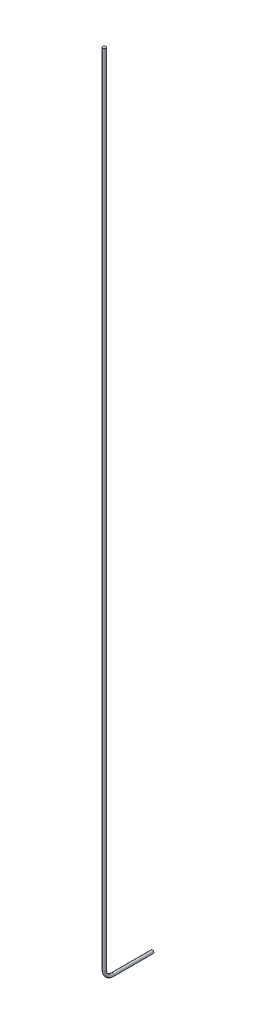
ISO-10303-21;
HEADER;
FILE_DESCRIPTION(('STEP AP214'),'2;1');
FILE_NAME('part.step','',(''),(''),'','','');
FILE_SCHEMA(('AUTOMOTIVE_DESIGN { 1 0 10303 214 1 1 1 1 }'));
ENDSEC;
DATA;
#1=APPLICATION_CONTEXT('core data for automotive mechanical design processes');
#2=APPLICATION_PROTOCOL_DEFINITION('international standard','automotive_design',2000,#1);
#3=PRODUCT_CONTEXT('',#1,'mechanical');
#4=PRODUCT('Part','Part','',(#3));
#5=PRODUCT_RELATED_PRODUCT_CATEGORY('part','',(#4));
#6=PRODUCT_DEFINITION_FORMATION('','',#4);
#7=PRODUCT_DEFINITION_CONTEXT('part definition',#1,'design');
#8=PRODUCT_DEFINITION('design','',#6,#7);
#9=PRODUCT_DEFINITION_SHAPE('','',#8);
#10=(LENGTH_UNIT() NAMED_UNIT(*) SI_UNIT(.MILLI.,.METRE.));
#11=(NAMED_UNIT(*) PLANE_ANGLE_UNIT() SI_UNIT($,.RADIAN.));
#12=(NAMED_UNIT(*) SI_UNIT($,.STERADIAN.) SOLID_ANGLE_UNIT());
#13=UNCERTAINTY_MEASURE_WITH_UNIT(LENGTH_MEASURE(1.E-05),#10,'distance_accuracy_value','');
#14=(GEOMETRIC_REPRESENTATION_CONTEXT(3) GLOBAL_UNCERTAINTY_ASSIGNED_CONTEXT((#13)) GLOBAL_UNIT_ASSIGNED_CONTEXT((#10,
#11,#12)) REPRESENTATION_CONTEXT('',''));
#15=CARTESIAN_POINT('',(0.,0.,0.));
#16=DIRECTION('',(0.,0.,1.));
#17=DIRECTION('',(1.,0.,0.));
#18=AXIS2_PLACEMENT_3D('',#15,#16,#17);
#19=CARTESIAN_POINT('',(0.,0.,20.));
#20=DIRECTION('',(0.,0.,-1.));
#21=DIRECTION('',(-1.,0.,0.));
#22=AXIS2_PLACEMENT_3D('',#19,#20,#21);
#23=CYLINDRICAL_SURFACE('',#22,0.98);
#24=CARTESIAN_POINT('',(0.,0.,0.));
#25=DIRECTION('',(0.,0.,1.));
#26=DIRECTION('',(1.,0.,0.));
#27=AXIS2_PLACEMENT_3D('',#24,#25,#26);
#28=CIRCLE('',#27,0.98);
#29=CARTESIAN_POINT('',(0.98,0.,0.));
#30=VERTEX_POINT('',#29);
#31=EDGE_CURVE('E10',#30,#30,#28,.T.);
#32=ORIENTED_EDGE('',*,*,#31,.T.);
#33=EDGE_LOOP('',(#32));
#34=FACE_BOUND('',#33,.T.);
#35=CARTESIAN_POINT('',(0.,0.,25.));
#36=DIRECTION('',(0.,0.,1.));
#37=DIRECTION('',(1.,0.,0.));
#38=AXIS2_PLACEMENT_3D('',#35,#36,#37);
#39=CIRCLE('',#38,0.98);
#40=CARTESIAN_POINT('',(0.,-0.979999999999836,25.));
#41=VERTEX_POINT('',#40);
#42=EDGE_CURVE('E56',#41,#41,#39,.T.);
#43=ORIENTED_EDGE('',*,*,#42,.F.);
#44=EDGE_LOOP('',(#43));
#45=FACE_BOUND('',#44,.T.);
#46=ADVANCED_FACE('F39',(#34,#45),#23,.T.);
#47=CARTESIAN_POINT('',(0.,0.,0.));
#48=DIRECTION('',(0.,0.,1.));
#49=DIRECTION('',(1.,0.,0.));
#50=AXIS2_PLACEMENT_3D('',#47,#48,#49);
#51=PLANE('',#50);
#52=ORIENTED_EDGE('',*,*,#31,.F.);
#53=EDGE_LOOP('',(#52));
#54=FACE_BOUND('',#53,.T.);
#55=ADVANCED_FACE('F66',(#54),#51,.F.);
#56=CARTESIAN_POINT('',(0.,505.,30.));
#57=DIRECTION('',(0.,1.,0.));
#58=DIRECTION('',(1.,0.,0.));
#59=AXIS2_PLACEMENT_3D('',#56,#57,#58);
#60=PLANE('',#59);
#61=CARTESIAN_POINT('',(0.,505.,30.));
#62=DIRECTION('',(0.,1.,0.));
#63=DIRECTION('',(1.,0.,0.));
#64=AXIS2_PLACEMENT_3D('',#61,#62,#63);
#65=CIRCLE('',#64,0.98);
#66=CARTESIAN_POINT('',(0.98,505.,30.));
#67=VERTEX_POINT('',#66);
#68=EDGE_CURVE('E46',#67,#67,#65,.T.);
#69=ORIENTED_EDGE('',*,*,#68,.T.);
#70=EDGE_LOOP('',(#69));
#71=FACE_BOUND('',#70,.T.);
#72=ADVANCED_FACE('F70',(#71),#60,.T.);
#73=CARTESIAN_POINT('',(0.,5.,25.));
#74=DIRECTION('',(-1.,0.,0.));
#75=DIRECTION('',(0.,0.,1.));
#76=AXIS2_PLACEMENT_3D('',#73,#74,#75);
#77=TOROIDAL_SURFACE('',#76,4.99999999999984,0.98);
#78=CARTESIAN_POINT('',(0.,5.,30.));
#79=DIRECTION('',(0.,1.,0.));
#80=DIRECTION('',(1.,0.,0.));
#81=AXIS2_PLACEMENT_3D('',#78,#79,#80);
#82=CIRCLE('',#81,0.98);
#83=CARTESIAN_POINT('',(0.,5.,30.9799999999998));
#84=VERTEX_POINT('',#83);
#85=EDGE_CURVE('E51',#84,#84,#82,.T.);
#86=CARTESIAN_POINT('',(0.,5.,25.));
#87=DIRECTION('',(-1.,0.,0.));
#88=DIRECTION('',(0.,0.,1.));
#89=AXIS2_PLACEMENT_3D('',#86,#87,#88);
#90=CIRCLE('',#89,5.97999999999984);
#91=EDGE_CURVE('',#41,#84,#90,.T.);
#92=ORIENTED_EDGE('',*,*,#42,.T.);
#93=ORIENTED_EDGE('',*,*,#85,.F.);
#94=ORIENTED_EDGE('',*,*,#91,.T.);
#95=ORIENTED_EDGE('',*,*,#91,.F.);
#96=EDGE_LOOP('',(#92,#94,#93,#95));
#97=FACE_BOUND('',#96,.T.);
#98=ADVANCED_FACE('F63',(#97),#77,.T.);
#99=CARTESIAN_POINT('',(0.,5.,30.));
#100=DIRECTION('',(0.,1.,0.));
#101=DIRECTION('',(0.,0.,1.));
#102=AXIS2_PLACEMENT_3D('',#99,#100,#101);
#103=CYLINDRICAL_SURFACE('',#102,0.98);
#104=ORIENTED_EDGE('',*,*,#68,.F.);
#105=EDGE_LOOP('',(#104));
#106=FACE_BOUND('',#105,.T.);
#107=ORIENTED_EDGE('',*,*,#85,.T.);
#108=EDGE_LOOP('',(#107));
#109=FACE_BOUND('',#108,.T.);
#110=ADVANCED_FACE('F72',(#106,#109),#103,.T.);
#111=CLOSED_SHELL('',(#46,#55,#72,#98,#110));
#112=MANIFOLD_SOLID_BREP('B2',#111);
#113=ADVANCED_BREP_SHAPE_REPRESENTATION('',(#18,#112),#14);
#114=SHAPE_DEFINITION_REPRESENTATION(#9,#113);
ENDSEC;
END-ISO-10303-21;
